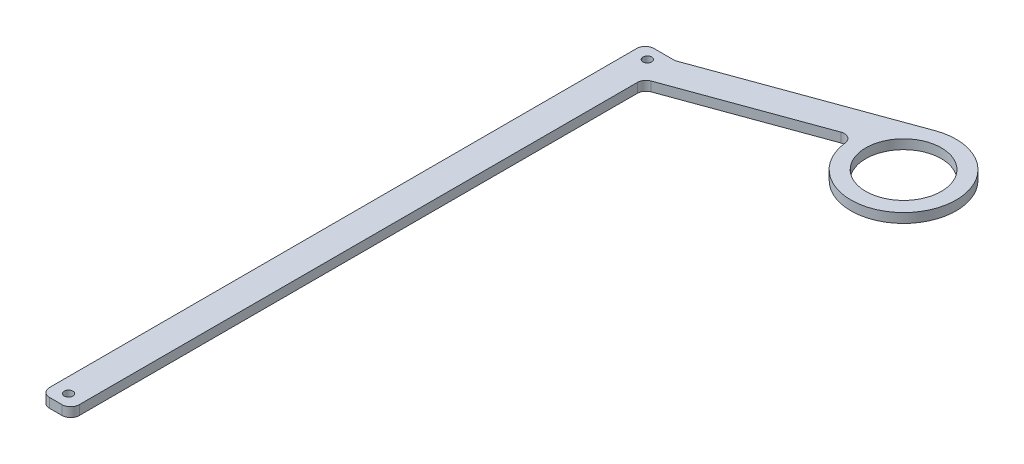
ISO-10303-21;
HEADER;
FILE_DESCRIPTION(('STEP AP214'),'2;1');
FILE_NAME('part.step','',(''),(''),'','','');
FILE_SCHEMA(('AUTOMOTIVE_DESIGN { 1 0 10303 214 1 1 1 1 }'));
ENDSEC;
DATA;
#1=APPLICATION_CONTEXT('core data for automotive mechanical design processes');
#2=APPLICATION_PROTOCOL_DEFINITION('international standard','automotive_design',2000,#1);
#3=PRODUCT_CONTEXT('',#1,'mechanical');
#4=PRODUCT('Part','Part','',(#3));
#5=PRODUCT_RELATED_PRODUCT_CATEGORY('part','',(#4));
#6=PRODUCT_DEFINITION_FORMATION('','',#4);
#7=PRODUCT_DEFINITION_CONTEXT('part definition',#1,'design');
#8=PRODUCT_DEFINITION('design','',#6,#7);
#9=PRODUCT_DEFINITION_SHAPE('','',#8);
#10=(LENGTH_UNIT() NAMED_UNIT(*) SI_UNIT(.MILLI.,.METRE.));
#11=(NAMED_UNIT(*) PLANE_ANGLE_UNIT() SI_UNIT($,.RADIAN.));
#12=(NAMED_UNIT(*) SI_UNIT($,.STERADIAN.) SOLID_ANGLE_UNIT());
#13=UNCERTAINTY_MEASURE_WITH_UNIT(LENGTH_MEASURE(1.E-05),#10,'distance_accuracy_value','');
#14=(GEOMETRIC_REPRESENTATION_CONTEXT(3) GLOBAL_UNCERTAINTY_ASSIGNED_CONTEXT((#13)) GLOBAL_UNIT_ASSIGNED_CONTEXT((#10,
#11,#12)) REPRESENTATION_CONTEXT('',''));
#15=CARTESIAN_POINT('',(0.,0.,0.));
#16=DIRECTION('',(0.,0.,1.));
#17=DIRECTION('',(1.,0.,0.));
#18=AXIS2_PLACEMENT_3D('',#15,#16,#17);
#19=CARTESIAN_POINT('',(75.124324920192,3.175,-108.287220396138));
#20=DIRECTION('',(0.,-1.,0.));
#21=DIRECTION('',(0.,0.,-1.));
#22=AXIS2_PLACEMENT_3D('',#19,#20,#21);
#23=PLANE('',#22);
#24=DIRECTION('',(-1.,0.,0.));
#25=VECTOR('',#24,1.);
#26=CARTESIAN_POINT('',(-5.00000000000001,3.175,-101.6));
#27=LINE('',#26,#25);
#28=CARTESIAN_POINT('',(4.48494888935058,3.175,-101.6));
#29=VERTEX_POINT('',#28);
#30=CARTESIAN_POINT('',(-2.07900000000001,3.175,-101.6));
#31=VERTEX_POINT('',#30);
#32=EDGE_CURVE('E161',#29,#31,#27,.T.);
#33=ORIENTED_EDGE('',*,*,#32,.T.);
#34=CARTESIAN_POINT('',(-2.07900000000001,3.175,-98.679));
#35=DIRECTION('',(0.,-1.,0.));
#36=DIRECTION('',(0.,0.,-1.));
#37=AXIS2_PLACEMENT_3D('',#34,#35,#36);
#38=CIRCLE('',#37,2.921);
#39=CARTESIAN_POINT('',(-5.00000000000001,3.175,-98.679));
#40=VERTEX_POINT('',#39);
#41=EDGE_CURVE('E217',#31,#40,#38,.F.);
#42=ORIENTED_EDGE('',*,*,#41,.T.);
#43=DIRECTION('',(0.,0.,1.));
#44=VECTOR('',#43,1.);
#45=CARTESIAN_POINT('',(-5.00000000000001,3.175,-101.6));
#46=LINE('',#45,#44);
#47=CARTESIAN_POINT('',(-4.99999999999998,3.175,98.679));
#48=VERTEX_POINT('',#47);
#49=EDGE_CURVE('E156',#40,#48,#46,.T.);
#50=ORIENTED_EDGE('',*,*,#49,.T.);
#51=CARTESIAN_POINT('',(-2.07899999999998,3.175,98.679));
#52=DIRECTION('',(0.,-1.,0.));
#53=DIRECTION('',(0.,0.,-1.));
#54=AXIS2_PLACEMENT_3D('',#51,#52,#53);
#55=CIRCLE('',#54,2.921);
#56=CARTESIAN_POINT('',(-2.07899999999998,3.175,101.6));
#57=VERTEX_POINT('',#56);
#58=EDGE_CURVE('E59',#48,#57,#55,.F.);
#59=ORIENTED_EDGE('',*,*,#58,.T.);
#60=DIRECTION('',(1.,0.,0.));
#61=VECTOR('',#60,1.);
#62=CARTESIAN_POINT('',(-4.99999999999998,3.175,101.6));
#63=LINE('',#62,#61);
#64=CARTESIAN_POINT('',(2.07900000000001,3.175,101.6));
#65=VERTEX_POINT('',#64);
#66=EDGE_CURVE('E184',#57,#65,#63,.T.);
#67=ORIENTED_EDGE('',*,*,#66,.T.);
#68=CARTESIAN_POINT('',(2.07900000000001,3.175,98.679));
#69=DIRECTION('',(0.,-1.,0.));
#70=DIRECTION('',(0.,0.,-1.));
#71=AXIS2_PLACEMENT_3D('',#68,#69,#70);
#72=CIRCLE('',#71,2.921);
#73=CARTESIAN_POINT('',(5.00000000000002,3.175,98.679));
#74=VERTEX_POINT('',#73);
#75=EDGE_CURVE('E214',#65,#74,#72,.F.);
#76=ORIENTED_EDGE('',*,*,#75,.T.);
#77=DIRECTION('',(0.,0.,-1.));
#78=VECTOR('',#77,1.);
#79=CARTESIAN_POINT('',(5.00000000000002,3.175,101.6));
#80=LINE('',#79,#78);
#81=CARTESIAN_POINT('',(5.00000000000001,3.175,-88.9129160561306));
#82=VERTEX_POINT('',#81);
#83=EDGE_CURVE('E263',#74,#82,#80,.T.);
#84=ORIENTED_EDGE('',*,*,#83,.T.);
#85=CARTESIAN_POINT('',(7.92100000000001,3.175,-88.9129160561306));
#86=DIRECTION('',(0.,-1.,0.));
#87=DIRECTION('',(0.,0.,-1.));
#88=AXIS2_PLACEMENT_3D('',#85,#86,#87);
#89=CIRCLE('',#88,2.921);
#90=CARTESIAN_POINT('',(6.92195916134574,3.175,-91.6577582014462));
#91=VERTEX_POINT('',#90);
#92=EDGE_CURVE('E228',#82,#91,#89,.T.);
#93=ORIENTED_EDGE('',*,*,#92,.T.);
#94=DIRECTION('',(0.93969262078591,0.,-0.342020143325663));
#95=VECTOR('',#94,1.);
#96=CARTESIAN_POINT('',(5.00000000000001,3.175,-90.9582222752411));
#97=LINE('',#96,#95);
#98=CARTESIAN_POINT('',(53.6409293381555,3.175,-108.662072721375));
#99=VERTEX_POINT('',#98);
#100=EDGE_CURVE('E145',#91,#99,#97,.T.);
#101=ORIENTED_EDGE('',*,*,#100,.T.);
#102=CARTESIAN_POINT('',(54.6399701768098,3.175,-105.917230576059));
#103=DIRECTION('',(0.,-1.,0.));
#104=DIRECTION('',(0.,0.,-1.));
#105=AXIS2_PLACEMENT_3D('',#102,#103,#104);
#106=CIRCLE('',#105,2.921);
#107=CARTESIAN_POINT('',(57.5416141419628,3.175,-106.25294369688));
#108=VERTEX_POINT('',#107);
#109=EDGE_CURVE('E141',#99,#108,#106,.T.);
#110=ORIENTED_EDGE('',*,*,#109,.T.);
#111=CARTESIAN_POINT('',(75.124324920192,3.175,-108.287220396138));
#112=DIRECTION('',(0.,1.,0.));
#113=DIRECTION('',(0.,0.,-1.));
#114=AXIS2_PLACEMENT_3D('',#111,#112,#113);
#115=CIRCLE('',#114,17.7);
#116=CARTESIAN_POINT('',(69.0705683833278,3.175,-124.919779784048));
#117=VERTEX_POINT('',#116);
#118=EDGE_CURVE('E132',#108,#117,#115,.T.);
#119=ORIENTED_EDGE('',*,*,#118,.T.);
#120=DIRECTION('',(-0.93969262078591,0.,0.342020143325665));
#121=VECTOR('',#120,1.);
#122=CARTESIAN_POINT('',(69.0705683833278,3.175,-124.919779784048));
#123=LINE('',#122,#121);
#124=CARTESIAN_POINT('',(5.48398972800486,3.175,-101.776157854684));
#125=VERTEX_POINT('',#124);
#126=EDGE_CURVE('E137',#117,#125,#123,.T.);
#127=ORIENTED_EDGE('',*,*,#126,.T.);
#128=CARTESIAN_POINT('',(4.48494888935058,3.175,-104.521));
#129=DIRECTION('',(0.,-1.,0.));
#130=DIRECTION('',(0.,0.,-1.));
#131=AXIS2_PLACEMENT_3D('',#128,#129,#130);
#132=CIRCLE('',#131,2.921);
#133=EDGE_CURVE('E11',#125,#29,#132,.T.);
#134=ORIENTED_EDGE('',*,*,#133,.T.);
#135=EDGE_LOOP('',(#33,#42,#50,#59,#67,#76,#84,#93,#101,#110,#119,#127,#134));
#136=FACE_BOUND('',#135,.T.);
#137=CARTESIAN_POINT('',(0.,3.175,97.28));
#138=DIRECTION('',(0.,1.,0.));
#139=DIRECTION('',(0.,0.,1.));
#140=AXIS2_PLACEMENT_3D('',#137,#138,#139);
#141=CIRCLE('',#140,1.4605);
#142=CARTESIAN_POINT('',(0.,3.175,98.7405));
#143=VERTEX_POINT('',#142);
#144=EDGE_CURVE('E170',#143,#143,#141,.T.);
#145=ORIENTED_EDGE('',*,*,#144,.F.);
#146=EDGE_LOOP('',(#145));
#147=FACE_BOUND('',#146,.T.);
#148=CARTESIAN_POINT('',(0.,3.175,-97.28));
#149=DIRECTION('',(0.,1.,0.));
#150=DIRECTION('',(0.,0.,1.));
#151=AXIS2_PLACEMENT_3D('',#148,#149,#150);
#152=CIRCLE('',#151,1.4605);
#153=CARTESIAN_POINT('',(0.,3.175,-95.8195));
#154=VERTEX_POINT('',#153);
#155=EDGE_CURVE('E271',#154,#154,#152,.T.);
#156=ORIENTED_EDGE('',*,*,#155,.F.);
#157=EDGE_LOOP('',(#156));
#158=FACE_BOUND('',#157,.T.);
#159=CARTESIAN_POINT('',(75.124324920192,3.175,-108.287220396138));
#160=DIRECTION('',(0.,1.,0.));
#161=DIRECTION('',(0.,0.,1.));
#162=AXIS2_PLACEMENT_3D('',#159,#160,#161);
#163=CIRCLE('',#162,12.7);
#164=CARTESIAN_POINT('',(75.124324920192,3.175,-95.5872203961376));
#165=VERTEX_POINT('',#164);
#166=EDGE_CURVE('E277',#165,#165,#163,.T.);
#167=ORIENTED_EDGE('',*,*,#166,.F.);
#168=EDGE_LOOP('',(#167));
#169=FACE_BOUND('',#168,.T.);
#170=ADVANCED_FACE('F37',(#136,#147,#158,#169),#23,.F.);
#171=CARTESIAN_POINT('',(75.124324920192,0.,-108.287220396138));
#172=DIRECTION('',(0.,-1.,0.));
#173=DIRECTION('',(0.,0.,-1.));
#174=AXIS2_PLACEMENT_3D('',#171,#172,#173);
#175=PLANE('',#174);
#176=CARTESIAN_POINT('',(0.,0.,-97.28));
#177=DIRECTION('',(0.,1.,0.));
#178=DIRECTION('',(0.,0.,1.));
#179=AXIS2_PLACEMENT_3D('',#176,#177,#178);
#180=CIRCLE('',#179,1.4605);
#181=CARTESIAN_POINT('',(0.,0.,-95.8195));
#182=VERTEX_POINT('',#181);
#183=EDGE_CURVE('E274',#182,#182,#180,.T.);
#184=ORIENTED_EDGE('',*,*,#183,.T.);
#185=EDGE_LOOP('',(#184));
#186=FACE_BOUND('',#185,.T.);
#187=DIRECTION('',(0.,0.,1.));
#188=VECTOR('',#187,1.);
#189=CARTESIAN_POINT('',(-5.00000000000001,0.,-101.6));
#190=LINE('',#189,#188);
#191=CARTESIAN_POINT('',(-5.00000000000001,0.,-98.679));
#192=VERTEX_POINT('',#191);
#193=CARTESIAN_POINT('',(-4.99999999999998,0.,98.679));
#194=VERTEX_POINT('',#193);
#195=EDGE_CURVE('E182',#192,#194,#190,.T.);
#196=ORIENTED_EDGE('',*,*,#195,.F.);
#197=CARTESIAN_POINT('',(-2.07900000000001,0.,-98.679));
#198=DIRECTION('',(0.,-1.,0.));
#199=DIRECTION('',(0.,0.,-1.));
#200=AXIS2_PLACEMENT_3D('',#197,#198,#199);
#201=CIRCLE('',#200,2.921);
#202=CARTESIAN_POINT('',(-2.07900000000001,0.,-101.6));
#203=VERTEX_POINT('',#202);
#204=EDGE_CURVE('E212',#192,#203,#201,.T.);
#205=ORIENTED_EDGE('',*,*,#204,.T.);
#206=DIRECTION('',(-1.,0.,0.));
#207=VECTOR('',#206,1.);
#208=CARTESIAN_POINT('',(-5.00000000000001,0.,-101.6));
#209=LINE('',#208,#207);
#210=CARTESIAN_POINT('',(4.48494888935058,0.,-101.6));
#211=VERTEX_POINT('',#210);
#212=EDGE_CURVE('E179',#211,#203,#209,.T.);
#213=ORIENTED_EDGE('',*,*,#212,.F.);
#214=CARTESIAN_POINT('',(4.48494888935058,0.,-104.521));
#215=DIRECTION('',(0.,-1.,0.));
#216=DIRECTION('',(0.,0.,-1.));
#217=AXIS2_PLACEMENT_3D('',#214,#215,#216);
#218=CIRCLE('',#217,2.921);
#219=CARTESIAN_POINT('',(5.48398972800486,0.,-101.776157854684));
#220=VERTEX_POINT('',#219);
#221=EDGE_CURVE('E45',#211,#220,#218,.F.);
#222=ORIENTED_EDGE('',*,*,#221,.T.);
#223=DIRECTION('',(-0.93969262078591,0.,0.342020143325665));
#224=VECTOR('',#223,1.);
#225=CARTESIAN_POINT('',(69.0705683833278,0.,-124.919779784048));
#226=LINE('',#225,#224);
#227=CARTESIAN_POINT('',(69.0705683833278,0.,-124.919779784048));
#228=VERTEX_POINT('',#227);
#229=EDGE_CURVE('E177',#228,#220,#226,.T.);
#230=ORIENTED_EDGE('',*,*,#229,.F.);
#231=CARTESIAN_POINT('',(75.124324920192,0.,-108.287220396138));
#232=DIRECTION('',(0.,1.,0.));
#233=DIRECTION('',(0.,0.,-1.));
#234=AXIS2_PLACEMENT_3D('',#231,#232,#233);
#235=CIRCLE('',#234,17.7);
#236=CARTESIAN_POINT('',(57.5416141419628,0.,-106.25294369688));
#237=VERTEX_POINT('',#236);
#238=EDGE_CURVE('E151',#237,#228,#235,.T.);
#239=ORIENTED_EDGE('',*,*,#238,.F.);
#240=CARTESIAN_POINT('',(54.6399701768098,0.,-105.917230576059));
#241=DIRECTION('',(0.,-1.,0.));
#242=DIRECTION('',(0.,0.,-1.));
#243=AXIS2_PLACEMENT_3D('',#240,#241,#242);
#244=CIRCLE('',#243,2.921);
#245=CARTESIAN_POINT('',(53.6409293381555,0.,-108.662072721375));
#246=VERTEX_POINT('',#245);
#247=EDGE_CURVE('E223',#237,#246,#244,.F.);
#248=ORIENTED_EDGE('',*,*,#247,.T.);
#249=DIRECTION('',(0.93969262078591,0.,-0.342020143325663));
#250=VECTOR('',#249,1.);
#251=CARTESIAN_POINT('',(5.00000000000001,0.,-90.9582222752411));
#252=LINE('',#251,#250);
#253=CARTESIAN_POINT('',(6.92195916134574,0.,-91.6577582014462));
#254=VERTEX_POINT('',#253);
#255=EDGE_CURVE('E173',#254,#246,#252,.T.);
#256=ORIENTED_EDGE('',*,*,#255,.F.);
#257=CARTESIAN_POINT('',(7.92100000000001,0.,-88.9129160561306));
#258=DIRECTION('',(0.,-1.,0.));
#259=DIRECTION('',(0.,0.,-1.));
#260=AXIS2_PLACEMENT_3D('',#257,#258,#259);
#261=CIRCLE('',#260,2.921);
#262=CARTESIAN_POINT('',(5.00000000000001,0.,-88.9129160561306));
#263=VERTEX_POINT('',#262);
#264=EDGE_CURVE('E226',#254,#263,#261,.F.);
#265=ORIENTED_EDGE('',*,*,#264,.T.);
#266=DIRECTION('',(0.,0.,-1.));
#267=VECTOR('',#266,1.);
#268=CARTESIAN_POINT('',(5.00000000000002,0.,101.6));
#269=LINE('',#268,#267);
#270=CARTESIAN_POINT('',(5.00000000000002,0.,98.679));
#271=VERTEX_POINT('',#270);
#272=EDGE_CURVE('E169',#271,#263,#269,.T.);
#273=ORIENTED_EDGE('',*,*,#272,.F.);
#274=CARTESIAN_POINT('',(2.07900000000001,0.,98.679));
#275=DIRECTION('',(0.,-1.,0.));
#276=DIRECTION('',(0.,0.,-1.));
#277=AXIS2_PLACEMENT_3D('',#274,#275,#276);
#278=CIRCLE('',#277,2.921);
#279=CARTESIAN_POINT('',(2.07900000000001,0.,101.6));
#280=VERTEX_POINT('',#279);
#281=EDGE_CURVE('E208',#271,#280,#278,.T.);
#282=ORIENTED_EDGE('',*,*,#281,.T.);
#283=DIRECTION('',(1.,0.,0.));
#284=VECTOR('',#283,1.);
#285=CARTESIAN_POINT('',(-4.99999999999998,0.,101.6));
#286=LINE('',#285,#284);
#287=CARTESIAN_POINT('',(-2.07899999999998,0.,101.6));
#288=VERTEX_POINT('',#287);
#289=EDGE_CURVE('E167',#288,#280,#286,.T.);
#290=ORIENTED_EDGE('',*,*,#289,.F.);
#291=CARTESIAN_POINT('',(-2.07899999999998,0.,98.679));
#292=DIRECTION('',(0.,-1.,0.));
#293=DIRECTION('',(0.,0.,-1.));
#294=AXIS2_PLACEMENT_3D('',#291,#292,#293);
#295=CIRCLE('',#294,2.921);
#296=EDGE_CURVE('E210',#288,#194,#295,.T.);
#297=ORIENTED_EDGE('',*,*,#296,.T.);
#298=EDGE_LOOP('',(#196,#205,#213,#222,#230,#239,#248,#256,#265,#273,#282,#290,#297));
#299=FACE_BOUND('',#298,.T.);
#300=CARTESIAN_POINT('',(0.,0.,97.28));
#301=DIRECTION('',(0.,1.,0.));
#302=DIRECTION('',(0.,0.,1.));
#303=AXIS2_PLACEMENT_3D('',#300,#301,#302);
#304=CIRCLE('',#303,1.4605);
#305=CARTESIAN_POINT('',(0.,0.,98.7405));
#306=VERTEX_POINT('',#305);
#307=EDGE_CURVE('E268',#306,#306,#304,.T.);
#308=ORIENTED_EDGE('',*,*,#307,.T.);
#309=EDGE_LOOP('',(#308));
#310=FACE_BOUND('',#309,.T.);
#311=CARTESIAN_POINT('',(75.124324920192,0.,-108.287220396138));
#312=DIRECTION('',(0.,1.,0.));
#313=DIRECTION('',(0.,0.,1.));
#314=AXIS2_PLACEMENT_3D('',#311,#312,#313);
#315=CIRCLE('',#314,12.7);
#316=CARTESIAN_POINT('',(75.124324920192,0.,-95.5872203961376));
#317=VERTEX_POINT('',#316);
#318=EDGE_CURVE('E280',#317,#317,#315,.T.);
#319=ORIENTED_EDGE('',*,*,#318,.T.);
#320=EDGE_LOOP('',(#319));
#321=FACE_BOUND('',#320,.T.);
#322=ADVANCED_FACE('F232',(#186,#299,#310,#321),#175,.T.);
#323=CARTESIAN_POINT('',(-4.99999999999998,3.175,101.6));
#324=DIRECTION('',(0.,0.,-1.));
#325=DIRECTION('',(-1.,0.,0.));
#326=AXIS2_PLACEMENT_3D('',#323,#324,#325);
#327=PLANE('',#326);
#328=ORIENTED_EDGE('',*,*,#66,.F.);
#329=DIRECTION('',(0.,-1.,0.));
#330=VECTOR('',#329,1.);
#331=CARTESIAN_POINT('',(-2.07899999999998,3.175,101.6));
#332=LINE('',#331,#330);
#333=EDGE_CURVE('E220',#57,#288,#332,.T.);
#334=ORIENTED_EDGE('',*,*,#333,.T.);
#335=ORIENTED_EDGE('',*,*,#289,.T.);
#336=DIRECTION('',(0.,-1.,0.));
#337=VECTOR('',#336,1.);
#338=CARTESIAN_POINT('',(2.07900000000001,3.175,101.6));
#339=LINE('',#338,#337);
#340=EDGE_CURVE('E52',#280,#65,#339,.F.);
#341=ORIENTED_EDGE('',*,*,#340,.T.);
#342=EDGE_LOOP('',(#328,#334,#335,#341));
#343=FACE_BOUND('',#342,.T.);
#344=ADVANCED_FACE('F253',(#343),#327,.F.);
#345=CARTESIAN_POINT('',(5.00000000000002,3.175,101.6));
#346=DIRECTION('',(-1.,0.,0.));
#347=DIRECTION('',(0.,0.,1.));
#348=AXIS2_PLACEMENT_3D('',#345,#346,#347);
#349=PLANE('',#348);
#350=ORIENTED_EDGE('',*,*,#272,.T.);
#351=DIRECTION('',(0.,-1.,0.));
#352=VECTOR('',#351,1.);
#353=CARTESIAN_POINT('',(5.00000000000001,3.175,-88.9129160561306));
#354=LINE('',#353,#352);
#355=EDGE_CURVE('E195',#263,#82,#354,.F.);
#356=ORIENTED_EDGE('',*,*,#355,.T.);
#357=ORIENTED_EDGE('',*,*,#83,.F.);
#358=DIRECTION('',(0.,-1.,0.));
#359=VECTOR('',#358,1.);
#360=CARTESIAN_POINT('',(5.00000000000002,3.175,98.679));
#361=LINE('',#360,#359);
#362=EDGE_CURVE('E192',#74,#271,#361,.T.);
#363=ORIENTED_EDGE('',*,*,#362,.T.);
#364=EDGE_LOOP('',(#350,#356,#357,#363));
#365=FACE_BOUND('',#364,.T.);
#366=ADVANCED_FACE('F260',(#365),#349,.F.);
#367=CARTESIAN_POINT('',(5.00000000000001,3.175,-90.9582222752411));
#368=DIRECTION('',(-0.342020143325663,0.,-0.93969262078591));
#369=DIRECTION('',(-0.939692620785911,0.,0.342020143325663));
#370=AXIS2_PLACEMENT_3D('',#367,#368,#369);
#371=PLANE('',#370);
#372=ORIENTED_EDGE('',*,*,#255,.T.);
#373=DIRECTION('',(0.,1.,0.));
#374=VECTOR('',#373,1.);
#375=CARTESIAN_POINT('',(53.6409293381555,3.175,-108.662072721375));
#376=LINE('',#375,#374);
#377=EDGE_CURVE('E190',#246,#99,#376,.T.);
#378=ORIENTED_EDGE('',*,*,#377,.T.);
#379=ORIENTED_EDGE('',*,*,#100,.F.);
#380=DIRECTION('',(0.,-1.,0.));
#381=VECTOR('',#380,1.);
#382=CARTESIAN_POINT('',(6.92195916134574,0.,-91.6577582014462));
#383=LINE('',#382,#381);
#384=EDGE_CURVE('E187',#91,#254,#383,.T.);
#385=ORIENTED_EDGE('',*,*,#384,.T.);
#386=EDGE_LOOP('',(#372,#378,#379,#385));
#387=FACE_BOUND('',#386,.T.);
#388=ADVANCED_FACE('F308',(#387),#371,.F.);
#389=CARTESIAN_POINT('',(75.124324920192,3.175,-108.287220396138));
#390=DIRECTION('',(0.,-1.,0.));
#391=DIRECTION('',(0.,0.,-1.));
#392=AXIS2_PLACEMENT_3D('',#389,#390,#391);
#393=CYLINDRICAL_SURFACE('',#392,17.7);
#394=ORIENTED_EDGE('',*,*,#118,.F.);
#395=DIRECTION('',(0.,-1.,0.));
#396=VECTOR('',#395,1.);
#397=CARTESIAN_POINT('',(57.5416141419627,3.175,-106.25294369688));
#398=LINE('',#397,#396);
#399=EDGE_CURVE('E155',#108,#237,#398,.T.);
#400=ORIENTED_EDGE('',*,*,#399,.T.);
#401=ORIENTED_EDGE('',*,*,#238,.T.);
#402=DIRECTION('',(0.,-1.,0.));
#403=VECTOR('',#402,1.);
#404=CARTESIAN_POINT('',(69.0705683833278,3.175,-124.919779784048));
#405=LINE('',#404,#403);
#406=EDGE_CURVE('E148',#117,#228,#405,.T.);
#407=ORIENTED_EDGE('',*,*,#406,.F.);
#408=EDGE_LOOP('',(#394,#400,#401,#407));
#409=FACE_BOUND('',#408,.T.);
#410=ADVANCED_FACE('F149',(#409),#393,.T.);
#411=CARTESIAN_POINT('',(69.0705683833278,3.175,-124.919779784048));
#412=DIRECTION('',(0.342020143325665,0.,0.93969262078591));
#413=DIRECTION('',(0.93969262078591,0.,-0.342020143325665));
#414=AXIS2_PLACEMENT_3D('',#411,#412,#413);
#415=PLANE('',#414);
#416=ORIENTED_EDGE('',*,*,#229,.T.);
#417=DIRECTION('',(0.,-1.,0.));
#418=VECTOR('',#417,1.);
#419=CARTESIAN_POINT('',(5.48398972800484,3.175,-101.776157854684));
#420=LINE('',#419,#418);
#421=EDGE_CURVE('E160',#220,#125,#420,.F.);
#422=ORIENTED_EDGE('',*,*,#421,.T.);
#423=ORIENTED_EDGE('',*,*,#126,.F.);
#424=ORIENTED_EDGE('',*,*,#406,.T.);
#425=EDGE_LOOP('',(#416,#422,#423,#424));
#426=FACE_BOUND('',#425,.T.);
#427=ADVANCED_FACE('F158',(#426),#415,.F.);
#428=CARTESIAN_POINT('',(-5.00000000000001,3.175,-101.6));
#429=DIRECTION('',(0.,0.,1.));
#430=DIRECTION('',(1.,0.,0.));
#431=AXIS2_PLACEMENT_3D('',#428,#429,#430);
#432=PLANE('',#431);
#433=ORIENTED_EDGE('',*,*,#32,.F.);
#434=DIRECTION('',(0.,-1.,0.));
#435=VECTOR('',#434,1.);
#436=CARTESIAN_POINT('',(4.48494888935058,0.,-101.6));
#437=LINE('',#436,#435);
#438=EDGE_CURVE('E199',#29,#211,#437,.T.);
#439=ORIENTED_EDGE('',*,*,#438,.T.);
#440=ORIENTED_EDGE('',*,*,#212,.T.);
#441=DIRECTION('',(0.,-1.,0.));
#442=VECTOR('',#441,1.);
#443=CARTESIAN_POINT('',(-2.07900000000001,3.175,-101.6));
#444=LINE('',#443,#442);
#445=EDGE_CURVE('E197',#203,#31,#444,.F.);
#446=ORIENTED_EDGE('',*,*,#445,.T.);
#447=EDGE_LOOP('',(#433,#439,#440,#446));
#448=FACE_BOUND('',#447,.T.);
#449=ADVANCED_FACE('F240',(#448),#432,.F.);
#450=CARTESIAN_POINT('',(-5.00000000000001,3.175,-101.6));
#451=DIRECTION('',(1.,0.,0.));
#452=DIRECTION('',(0.,0.,-1.));
#453=AXIS2_PLACEMENT_3D('',#450,#451,#452);
#454=PLANE('',#453);
#455=ORIENTED_EDGE('',*,*,#49,.F.);
#456=DIRECTION('',(0.,-1.,0.));
#457=VECTOR('',#456,1.);
#458=CARTESIAN_POINT('',(-5.00000000000001,3.175,-98.679));
#459=LINE('',#458,#457);
#460=EDGE_CURVE('E205',#40,#192,#459,.T.);
#461=ORIENTED_EDGE('',*,*,#460,.T.);
#462=ORIENTED_EDGE('',*,*,#195,.T.);
#463=DIRECTION('',(0.,-1.,0.));
#464=VECTOR('',#463,1.);
#465=CARTESIAN_POINT('',(-4.99999999999998,3.175,98.679));
#466=LINE('',#465,#464);
#467=EDGE_CURVE('E203',#194,#48,#466,.F.);
#468=ORIENTED_EDGE('',*,*,#467,.T.);
#469=EDGE_LOOP('',(#455,#461,#462,#468));
#470=FACE_BOUND('',#469,.T.);
#471=ADVANCED_FACE('F247',(#470),#454,.F.);
#472=CARTESIAN_POINT('',(0.,3.175,97.28));
#473=DIRECTION('',(0.,-1.,0.));
#474=DIRECTION('',(0.,0.,-1.));
#475=AXIS2_PLACEMENT_3D('',#472,#473,#474);
#476=CYLINDRICAL_SURFACE('',#475,1.4605);
#477=ORIENTED_EDGE('',*,*,#144,.T.);
#478=EDGE_LOOP('',(#477));
#479=FACE_BOUND('',#478,.T.);
#480=ORIENTED_EDGE('',*,*,#307,.F.);
#481=EDGE_LOOP('',(#480));
#482=FACE_BOUND('',#481,.T.);
#483=ADVANCED_FACE('F297',(#479,#482),#476,.F.);
#484=CARTESIAN_POINT('',(0.,3.175,-97.28));
#485=DIRECTION('',(0.,-1.,0.));
#486=DIRECTION('',(0.,0.,-1.));
#487=AXIS2_PLACEMENT_3D('',#484,#485,#486);
#488=CYLINDRICAL_SURFACE('',#487,1.4605);
#489=ORIENTED_EDGE('',*,*,#155,.T.);
#490=EDGE_LOOP('',(#489));
#491=FACE_BOUND('',#490,.T.);
#492=ORIENTED_EDGE('',*,*,#183,.F.);
#493=EDGE_LOOP('',(#492));
#494=FACE_BOUND('',#493,.T.);
#495=ADVANCED_FACE('F439',(#491,#494),#488,.F.);
#496=CARTESIAN_POINT('',(75.124324920192,3.175,-108.287220396138));
#497=DIRECTION('',(0.,-1.,0.));
#498=DIRECTION('',(0.,0.,-1.));
#499=AXIS2_PLACEMENT_3D('',#496,#497,#498);
#500=CYLINDRICAL_SURFACE('',#499,12.7);
#501=ORIENTED_EDGE('',*,*,#166,.T.);
#502=EDGE_LOOP('',(#501));
#503=FACE_BOUND('',#502,.T.);
#504=ORIENTED_EDGE('',*,*,#318,.F.);
#505=EDGE_LOOP('',(#504));
#506=FACE_BOUND('',#505,.T.);
#507=ADVANCED_FACE('F286',(#503,#506),#500,.F.);
#508=CARTESIAN_POINT('',(54.6399701768098,3.175,-105.917230576059));
#509=DIRECTION('',(0.,-1.,0.));
#510=DIRECTION('',(0.,0.,-1.));
#511=AXIS2_PLACEMENT_3D('',#508,#509,#510);
#512=CYLINDRICAL_SURFACE('',#511,2.921);
#513=ORIENTED_EDGE('',*,*,#109,.F.);
#514=ORIENTED_EDGE('',*,*,#377,.F.);
#515=ORIENTED_EDGE('',*,*,#247,.F.);
#516=ORIENTED_EDGE('',*,*,#399,.F.);
#517=EDGE_LOOP('',(#513,#514,#515,#516));
#518=FACE_BOUND('',#517,.T.);
#519=ADVANCED_FACE('F316',(#518),#512,.F.);
#520=CARTESIAN_POINT('',(7.92100000000001,3.175,-88.9129160561306));
#521=DIRECTION('',(0.,1.,0.));
#522=DIRECTION('',(0.,0.,1.));
#523=AXIS2_PLACEMENT_3D('',#520,#521,#522);
#524=CYLINDRICAL_SURFACE('',#523,2.921);
#525=ORIENTED_EDGE('',*,*,#92,.F.);
#526=ORIENTED_EDGE('',*,*,#355,.F.);
#527=ORIENTED_EDGE('',*,*,#264,.F.);
#528=ORIENTED_EDGE('',*,*,#384,.F.);
#529=EDGE_LOOP('',(#525,#526,#527,#528));
#530=FACE_BOUND('',#529,.T.);
#531=ADVANCED_FACE('F319',(#530),#524,.F.);
#532=CARTESIAN_POINT('',(4.48494888935058,3.175,-104.521));
#533=DIRECTION('',(0.,1.,0.));
#534=DIRECTION('',(0.,0.,1.));
#535=AXIS2_PLACEMENT_3D('',#532,#533,#534);
#536=CYLINDRICAL_SURFACE('',#535,2.921);
#537=ORIENTED_EDGE('',*,*,#133,.F.);
#538=ORIENTED_EDGE('',*,*,#421,.F.);
#539=ORIENTED_EDGE('',*,*,#221,.F.);
#540=ORIENTED_EDGE('',*,*,#438,.F.);
#541=EDGE_LOOP('',(#537,#538,#539,#540));
#542=FACE_BOUND('',#541,.T.);
#543=ADVANCED_FACE('F236',(#542),#536,.F.);
#544=CARTESIAN_POINT('',(-2.07900000000001,3.175,-98.679));
#545=DIRECTION('',(0.,-1.,0.));
#546=DIRECTION('',(0.,0.,-1.));
#547=AXIS2_PLACEMENT_3D('',#544,#545,#546);
#548=CYLINDRICAL_SURFACE('',#547,2.921);
#549=ORIENTED_EDGE('',*,*,#41,.F.);
#550=ORIENTED_EDGE('',*,*,#445,.F.);
#551=ORIENTED_EDGE('',*,*,#204,.F.);
#552=ORIENTED_EDGE('',*,*,#460,.F.);
#553=EDGE_LOOP('',(#549,#550,#551,#552));
#554=FACE_BOUND('',#553,.T.);
#555=ADVANCED_FACE('F243',(#554),#548,.T.);
#556=CARTESIAN_POINT('',(-2.07899999999998,3.175,98.679));
#557=DIRECTION('',(0.,-1.,0.));
#558=DIRECTION('',(0.,0.,-1.));
#559=AXIS2_PLACEMENT_3D('',#556,#557,#558);
#560=CYLINDRICAL_SURFACE('',#559,2.921);
#561=ORIENTED_EDGE('',*,*,#58,.F.);
#562=ORIENTED_EDGE('',*,*,#467,.F.);
#563=ORIENTED_EDGE('',*,*,#296,.F.);
#564=ORIENTED_EDGE('',*,*,#333,.F.);
#565=EDGE_LOOP('',(#561,#562,#563,#564));
#566=FACE_BOUND('',#565,.T.);
#567=ADVANCED_FACE('F250',(#566),#560,.T.);
#568=CARTESIAN_POINT('',(2.07900000000001,3.175,98.679));
#569=DIRECTION('',(0.,-1.,0.));
#570=DIRECTION('',(0.,0.,-1.));
#571=AXIS2_PLACEMENT_3D('',#568,#569,#570);
#572=CYLINDRICAL_SURFACE('',#571,2.921);
#573=ORIENTED_EDGE('',*,*,#75,.F.);
#574=ORIENTED_EDGE('',*,*,#340,.F.);
#575=ORIENTED_EDGE('',*,*,#281,.F.);
#576=ORIENTED_EDGE('',*,*,#362,.F.);
#577=EDGE_LOOP('',(#573,#574,#575,#576));
#578=FACE_BOUND('',#577,.T.);
#579=ADVANCED_FACE('F39',(#578),#572,.T.);
#580=CLOSED_SHELL('',(#170,#322,#344,#366,#388,#410,#427,#449,#471,#483,#495,#507,#519,#531,
#543,#555,#567,#579));
#581=MANIFOLD_SOLID_BREP('B2',#580);
#582=ADVANCED_BREP_SHAPE_REPRESENTATION('',(#18,#581),#14);
#583=SHAPE_DEFINITION_REPRESENTATION(#9,#582);
ENDSEC;
END-ISO-10303-21;
